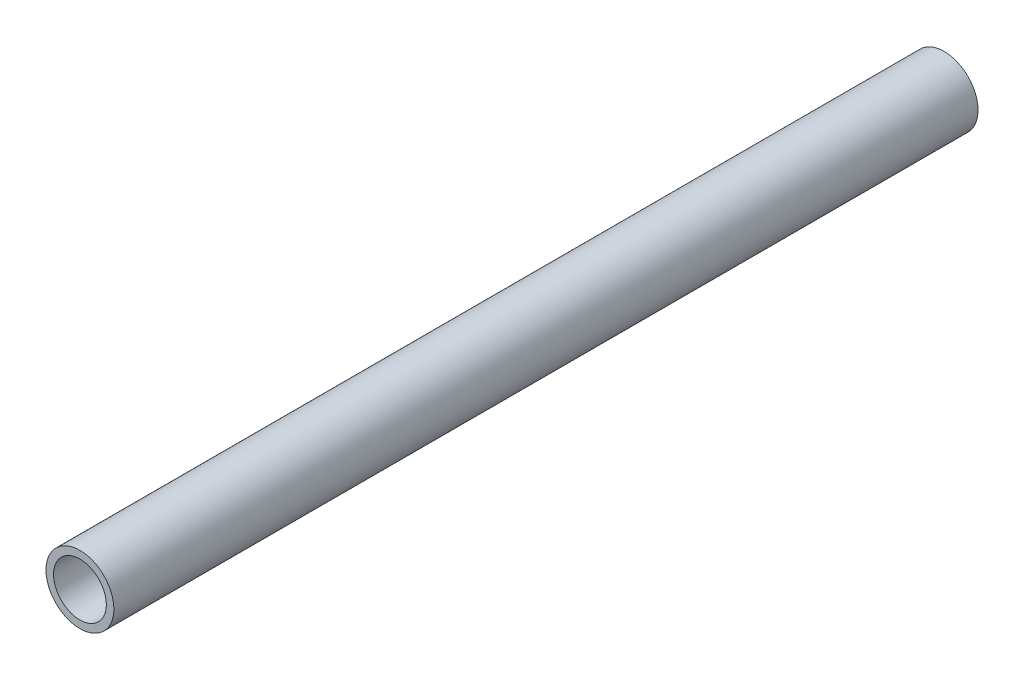
ISO-10303-21;
HEADER;
FILE_DESCRIPTION(('STEP AP214'),'2;1');
FILE_NAME('part.step','',(''),(''),'','','');
FILE_SCHEMA(('AUTOMOTIVE_DESIGN { 1 0 10303 214 1 1 1 1 }'));
ENDSEC;
DATA;
#1=APPLICATION_CONTEXT('core data for automotive mechanical design processes');
#2=APPLICATION_PROTOCOL_DEFINITION('international standard','automotive_design',2000,#1);
#3=PRODUCT_CONTEXT('',#1,'mechanical');
#4=PRODUCT('Part','Part','',(#3));
#5=PRODUCT_RELATED_PRODUCT_CATEGORY('part','',(#4));
#6=PRODUCT_DEFINITION_FORMATION('','',#4);
#7=PRODUCT_DEFINITION_CONTEXT('part definition',#1,'design');
#8=PRODUCT_DEFINITION('design','',#6,#7);
#9=PRODUCT_DEFINITION_SHAPE('','',#8);
#10=(LENGTH_UNIT() NAMED_UNIT(*) SI_UNIT(.MILLI.,.METRE.));
#11=(NAMED_UNIT(*) PLANE_ANGLE_UNIT() SI_UNIT($,.RADIAN.));
#12=(NAMED_UNIT(*) SI_UNIT($,.STERADIAN.) SOLID_ANGLE_UNIT());
#13=UNCERTAINTY_MEASURE_WITH_UNIT(LENGTH_MEASURE(1.E-05),#10,'distance_accuracy_value','');
#14=(GEOMETRIC_REPRESENTATION_CONTEXT(3) GLOBAL_UNCERTAINTY_ASSIGNED_CONTEXT((#13)) GLOBAL_UNIT_ASSIGNED_CONTEXT((#10,
#11,#12)) REPRESENTATION_CONTEXT('',''));
#15=CARTESIAN_POINT('',(0.,0.,0.));
#16=DIRECTION('',(0.,0.,1.));
#17=DIRECTION('',(1.,0.,0.));
#18=AXIS2_PLACEMENT_3D('',#15,#16,#17);
#19=CARTESIAN_POINT('',(0.,0.,229.2769));
#20=DIRECTION('',(0.,0.,1.));
#21=DIRECTION('',(1.,0.,0.));
#22=AXIS2_PLACEMENT_3D('',#19,#20,#21);
#23=PLANE('',#22);
#24=CARTESIAN_POINT('',(0.,0.,229.2769));
#25=DIRECTION('',(0.,0.,1.));
#26=DIRECTION('',(1.,0.,0.));
#27=AXIS2_PLACEMENT_3D('',#24,#25,#26);
#28=CIRCLE('',#27,9.);
#29=CARTESIAN_POINT('',(-9.,0.,229.2769));
#30=VERTEX_POINT('',#29);
#31=EDGE_CURVE('E10',#30,#30,#28,.T.);
#32=ORIENTED_EDGE('',*,*,#31,.T.);
#33=EDGE_LOOP('',(#32));
#34=FACE_BOUND('',#33,.T.);
#35=CARTESIAN_POINT('',(0.,0.,229.2769));
#36=DIRECTION('',(0.,0.,1.));
#37=DIRECTION('',(1.,0.,0.));
#38=AXIS2_PLACEMENT_3D('',#35,#36,#37);
#39=CIRCLE('',#38,7.);
#40=CARTESIAN_POINT('',(-7.,0.,229.2769));
#41=VERTEX_POINT('',#40);
#42=EDGE_CURVE('E44',#41,#41,#39,.T.);
#43=ORIENTED_EDGE('',*,*,#42,.F.);
#44=EDGE_LOOP('',(#43));
#45=FACE_BOUND('',#44,.T.);
#46=ADVANCED_FACE('F33',(#34,#45),#23,.T.);
#47=CARTESIAN_POINT('',(0.,0.,0.));
#48=DIRECTION('',(0.,0.,1.));
#49=DIRECTION('',(1.,0.,0.));
#50=AXIS2_PLACEMENT_3D('',#47,#48,#49);
#51=PLANE('',#50);
#52=CARTESIAN_POINT('',(0.,0.,0.));
#53=DIRECTION('',(0.,0.,1.));
#54=DIRECTION('',(1.,0.,0.));
#55=AXIS2_PLACEMENT_3D('',#52,#53,#54);
#56=CIRCLE('',#55,9.);
#57=CARTESIAN_POINT('',(-9.,0.,0.));
#58=VERTEX_POINT('',#57);
#59=EDGE_CURVE('E37',#58,#58,#56,.T.);
#60=ORIENTED_EDGE('',*,*,#59,.F.);
#61=EDGE_LOOP('',(#60));
#62=FACE_BOUND('',#61,.T.);
#63=CARTESIAN_POINT('',(0.,0.,0.));
#64=DIRECTION('',(0.,0.,1.));
#65=DIRECTION('',(1.,0.,0.));
#66=AXIS2_PLACEMENT_3D('',#63,#64,#65);
#67=CIRCLE('',#66,7.);
#68=CARTESIAN_POINT('',(-7.,0.,0.));
#69=VERTEX_POINT('',#68);
#70=EDGE_CURVE('E46',#69,#69,#67,.T.);
#71=ORIENTED_EDGE('',*,*,#70,.T.);
#72=EDGE_LOOP('',(#71));
#73=FACE_BOUND('',#72,.T.);
#74=ADVANCED_FACE('F56',(#62,#73),#51,.F.);
#75=CARTESIAN_POINT('',(0.,0.,229.2769));
#76=DIRECTION('',(0.,0.,-1.));
#77=DIRECTION('',(-1.,0.,0.));
#78=AXIS2_PLACEMENT_3D('',#75,#76,#77);
#79=CYLINDRICAL_SURFACE('',#78,9.);
#80=CARTESIAN_POINT('',(-9.,0.,229.2769));
#81=CARTESIAN_POINT('',(-9.,0.,226.888598958333));
#82=CARTESIAN_POINT('',(-9.,0.,224.500297916667));
#83=CARTESIAN_POINT('',(-9.,0.,219.723695833333));
#84=CARTESIAN_POINT('',(-9.,0.,217.335394791667));
#85=CARTESIAN_POINT('',(-9.,0.,212.558792708333));
#86=CARTESIAN_POINT('',(-9.,0.,210.170491666667));
#87=CARTESIAN_POINT('',(-9.,0.,205.393889583333));
#88=CARTESIAN_POINT('',(-9.,0.,203.005588541667));
#89=CARTESIAN_POINT('',(-9.,0.,198.228986458333));
#90=CARTESIAN_POINT('',(-9.,0.,195.840685416667));
#91=CARTESIAN_POINT('',(-9.,0.,191.064083333333));
#92=CARTESIAN_POINT('',(-9.,0.,188.675782291667));
#93=CARTESIAN_POINT('',(-9.,0.,183.899180208333));
#94=CARTESIAN_POINT('',(-9.,0.,181.510879166667));
#95=CARTESIAN_POINT('',(-9.,0.,176.734277083333));
#96=CARTESIAN_POINT('',(-9.,0.,174.345976041667));
#97=CARTESIAN_POINT('',(-9.,0.,169.569373958333));
#98=CARTESIAN_POINT('',(-9.,0.,167.181072916667));
#99=CARTESIAN_POINT('',(-9.,0.,162.404470833333));
#100=CARTESIAN_POINT('',(-9.,0.,160.016169791667));
#101=CARTESIAN_POINT('',(-9.,0.,155.239567708333));
#102=CARTESIAN_POINT('',(-9.,0.,152.851266666667));
#103=CARTESIAN_POINT('',(-9.,0.,148.074664583333));
#104=CARTESIAN_POINT('',(-9.,0.,145.686363541667));
#105=CARTESIAN_POINT('',(-9.,0.,140.909761458333));
#106=CARTESIAN_POINT('',(-9.,0.,138.521460416667));
#107=CARTESIAN_POINT('',(-9.,0.,133.744858333333));
#108=CARTESIAN_POINT('',(-9.,0.,131.356557291667));
#109=CARTESIAN_POINT('',(-9.,0.,126.579955208333));
#110=CARTESIAN_POINT('',(-9.,0.,124.191654166667));
#111=CARTESIAN_POINT('',(-9.,0.,119.415052083333));
#112=CARTESIAN_POINT('',(-9.,0.,117.026751041667));
#113=CARTESIAN_POINT('',(-9.,0.,112.250148958333));
#114=CARTESIAN_POINT('',(-9.,0.,109.861847916667));
#115=CARTESIAN_POINT('',(-9.,0.,105.085245833333));
#116=CARTESIAN_POINT('',(-9.,0.,102.696944791667));
#117=CARTESIAN_POINT('',(-9.,0.,97.9203427083334));
#118=CARTESIAN_POINT('',(-9.,0.,95.5320416666667));
#119=CARTESIAN_POINT('',(-9.,0.,90.7554395833333));
#120=CARTESIAN_POINT('',(-9.,0.,88.3671385416666));
#121=CARTESIAN_POINT('',(-9.,0.,83.5905364583333));
#122=CARTESIAN_POINT('',(-9.,0.,81.2022354166667));
#123=CARTESIAN_POINT('',(-9.,0.,76.4256333333333));
#124=CARTESIAN_POINT('',(-9.,0.,74.0373322916667));
#125=CARTESIAN_POINT('',(-9.,0.,69.2607302083333));
#126=CARTESIAN_POINT('',(-9.,0.,66.8724291666666));
#127=CARTESIAN_POINT('',(-9.,0.,62.0958270833333));
#128=CARTESIAN_POINT('',(-9.,0.,59.7075260416667));
#129=CARTESIAN_POINT('',(-9.,0.,54.9309239583333));
#130=CARTESIAN_POINT('',(-9.,0.,52.5426229166667));
#131=CARTESIAN_POINT('',(-9.,0.,47.7660208333333));
#132=CARTESIAN_POINT('',(-9.,0.,45.3777197916666));
#133=CARTESIAN_POINT('',(-9.,0.,40.6011177083333));
#134=CARTESIAN_POINT('',(-9.,0.,38.2128166666666));
#135=CARTESIAN_POINT('',(-9.,0.,33.4362145833333));
#136=CARTESIAN_POINT('',(-9.,0.,31.0479135416666));
#137=CARTESIAN_POINT('',(-9.,0.,26.2713114583333));
#138=CARTESIAN_POINT('',(-9.,0.,23.8830104166666));
#139=CARTESIAN_POINT('',(-9.,0.,19.1064083333333));
#140=CARTESIAN_POINT('',(-9.,0.,16.7181072916666));
#141=CARTESIAN_POINT('',(-9.,0.,11.9415052083333));
#142=CARTESIAN_POINT('',(-9.,0.,9.55320416666664));
#143=CARTESIAN_POINT('',(-9.,0.,4.77660208333331));
#144=CARTESIAN_POINT('',(-9.,0.,2.38830104166664));
#145=CARTESIAN_POINT('',(-9.,0.,0.));
#146=B_SPLINE_CURVE_WITH_KNOTS('',3,(#80,#81,#82,#83,#84,#85,#86,#87,#88,#89,#90,#91,#92,#93,
#94,#95,#96,#97,#98,#99,#100,#101,#102,#103,#104,#105,#106,#107,#108,#109,#110,#111,#112,#113,
#114,#115,#116,#117,#118,#119,#120,#121,#122,#123,#124,#125,#126,#127,#128,#129,#130,#131,#132,
#133,#134,#135,#136,#137,#138,#139,#140,#141,#142,#143,#144,#145),.UNSPECIFIED.,.F.,.F.,(4,2,2,
2,2,2,2,2,2,2,2,2,2,2,2,2,2,2,2,2,2,2,2,2,2,2,2,2,2,2,2,2,4),(0.,7.16490312500001,14.32980625,
21.494709375,28.6596125,35.824515625,42.98941875,50.154321875,57.319225,64.484128125,
71.64903125,78.813934375,85.9788375,93.143740625,100.30864375,107.473546875,114.63845,
121.803353125,128.96825625,136.133159375,143.2980625,150.462965625,157.62786875,164.792771875,
171.957675,179.122578125,186.28748125,193.452384375,200.6172875,207.782190625,214.94709375,
222.111996875,229.2769),.UNSPECIFIED.);
#147=EDGE_CURVE('BSEAM35',#30,#58,#146,.T.);
#148=ORIENTED_EDGE('',*,*,#31,.F.);
#149=ORIENTED_EDGE('',*,*,#59,.T.);
#150=ORIENTED_EDGE('',*,*,#147,.T.);
#151=ORIENTED_EDGE('',*,*,#147,.F.);
#152=EDGE_LOOP('',(#148,#150,#149,#151));
#153=FACE_BOUND('',#152,.T.);
#154=ADVANCED_FACE('F35',(#153),#79,.T.);
#155=CARTESIAN_POINT('',(0.,0.,229.2769));
#156=DIRECTION('',(0.,0.,-1.));
#157=DIRECTION('',(-1.,0.,0.));
#158=AXIS2_PLACEMENT_3D('',#155,#156,#157);
#159=CYLINDRICAL_SURFACE('',#158,7.);
#160=CARTESIAN_POINT('',(-7.,0.,229.2769));
#161=CARTESIAN_POINT('',(-7.,0.,226.888598958333));
#162=CARTESIAN_POINT('',(-7.,0.,224.500297916667));
#163=CARTESIAN_POINT('',(-7.,0.,219.723695833333));
#164=CARTESIAN_POINT('',(-7.,0.,217.335394791667));
#165=CARTESIAN_POINT('',(-7.,0.,212.558792708333));
#166=CARTESIAN_POINT('',(-7.,0.,210.170491666667));
#167=CARTESIAN_POINT('',(-7.,0.,205.393889583333));
#168=CARTESIAN_POINT('',(-7.,0.,203.005588541667));
#169=CARTESIAN_POINT('',(-7.,0.,198.228986458333));
#170=CARTESIAN_POINT('',(-7.,0.,195.840685416667));
#171=CARTESIAN_POINT('',(-7.,0.,191.064083333333));
#172=CARTESIAN_POINT('',(-7.,0.,188.675782291667));
#173=CARTESIAN_POINT('',(-7.,0.,183.899180208333));
#174=CARTESIAN_POINT('',(-7.,0.,181.510879166667));
#175=CARTESIAN_POINT('',(-7.,0.,176.734277083333));
#176=CARTESIAN_POINT('',(-7.,0.,174.345976041667));
#177=CARTESIAN_POINT('',(-7.,0.,169.569373958333));
#178=CARTESIAN_POINT('',(-7.,0.,167.181072916667));
#179=CARTESIAN_POINT('',(-7.,0.,162.404470833333));
#180=CARTESIAN_POINT('',(-7.,0.,160.016169791667));
#181=CARTESIAN_POINT('',(-7.,0.,155.239567708333));
#182=CARTESIAN_POINT('',(-7.,0.,152.851266666667));
#183=CARTESIAN_POINT('',(-7.,0.,148.074664583333));
#184=CARTESIAN_POINT('',(-7.,0.,145.686363541667));
#185=CARTESIAN_POINT('',(-7.,0.,140.909761458333));
#186=CARTESIAN_POINT('',(-7.,0.,138.521460416667));
#187=CARTESIAN_POINT('',(-7.,0.,133.744858333333));
#188=CARTESIAN_POINT('',(-7.,0.,131.356557291667));
#189=CARTESIAN_POINT('',(-7.,0.,126.579955208333));
#190=CARTESIAN_POINT('',(-7.,0.,124.191654166667));
#191=CARTESIAN_POINT('',(-7.,0.,119.415052083333));
#192=CARTESIAN_POINT('',(-7.,0.,117.026751041667));
#193=CARTESIAN_POINT('',(-7.,0.,112.250148958333));
#194=CARTESIAN_POINT('',(-7.,0.,109.861847916667));
#195=CARTESIAN_POINT('',(-7.,0.,105.085245833333));
#196=CARTESIAN_POINT('',(-7.,0.,102.696944791667));
#197=CARTESIAN_POINT('',(-7.,0.,97.9203427083334));
#198=CARTESIAN_POINT('',(-7.,0.,95.5320416666667));
#199=CARTESIAN_POINT('',(-7.,0.,90.7554395833333));
#200=CARTESIAN_POINT('',(-7.,0.,88.3671385416666));
#201=CARTESIAN_POINT('',(-7.,0.,83.5905364583333));
#202=CARTESIAN_POINT('',(-7.,0.,81.2022354166667));
#203=CARTESIAN_POINT('',(-7.,0.,76.4256333333333));
#204=CARTESIAN_POINT('',(-7.,0.,74.0373322916667));
#205=CARTESIAN_POINT('',(-7.,0.,69.2607302083333));
#206=CARTESIAN_POINT('',(-7.,0.,66.8724291666666));
#207=CARTESIAN_POINT('',(-7.,0.,62.0958270833333));
#208=CARTESIAN_POINT('',(-7.,0.,59.7075260416667));
#209=CARTESIAN_POINT('',(-7.,0.,54.9309239583333));
#210=CARTESIAN_POINT('',(-7.,0.,52.5426229166667));
#211=CARTESIAN_POINT('',(-7.,0.,47.7660208333333));
#212=CARTESIAN_POINT('',(-7.,0.,45.3777197916666));
#213=CARTESIAN_POINT('',(-7.,0.,40.6011177083333));
#214=CARTESIAN_POINT('',(-7.,0.,38.2128166666666));
#215=CARTESIAN_POINT('',(-7.,0.,33.4362145833333));
#216=CARTESIAN_POINT('',(-7.,0.,31.0479135416666));
#217=CARTESIAN_POINT('',(-7.,0.,26.2713114583333));
#218=CARTESIAN_POINT('',(-7.,0.,23.8830104166666));
#219=CARTESIAN_POINT('',(-7.,0.,19.1064083333333));
#220=CARTESIAN_POINT('',(-7.,0.,16.7181072916666));
#221=CARTESIAN_POINT('',(-7.,0.,11.9415052083333));
#222=CARTESIAN_POINT('',(-7.,0.,9.55320416666664));
#223=CARTESIAN_POINT('',(-7.,0.,4.77660208333331));
#224=CARTESIAN_POINT('',(-7.,0.,2.38830104166664));
#225=CARTESIAN_POINT('',(-7.,0.,0.));
#226=B_SPLINE_CURVE_WITH_KNOTS('',3,(#160,#161,#162,#163,#164,#165,#166,#167,#168,#169,#170,
#171,#172,#173,#174,#175,#176,#177,#178,#179,#180,#181,#182,#183,#184,#185,#186,#187,#188,#189,
#190,#191,#192,#193,#194,#195,#196,#197,#198,#199,#200,#201,#202,#203,#204,#205,#206,#207,#208,
#209,#210,#211,#212,#213,#214,#215,#216,#217,#218,#219,#220,#221,#222,#223,#224,#225),
.UNSPECIFIED.,.F.,.F.,(4,2,2,2,2,2,2,2,2,2,2,2,2,2,2,2,2,2,2,2,2,2,2,2,2,2,2,2,2,2,2,2,4),(0.,
7.16490312500001,14.32980625,21.494709375,28.6596125,35.824515625,42.98941875,50.154321875,
57.319225,64.484128125,71.64903125,78.813934375,85.9788375,93.143740625,100.30864375,
107.473546875,114.63845,121.803353125,128.96825625,136.133159375,143.2980625,150.462965625,
157.62786875,164.792771875,171.957675,179.122578125,186.28748125,193.452384375,200.6172875,
207.782190625,214.94709375,222.111996875,229.2769),.UNSPECIFIED.);
#227=EDGE_CURVE('BSEAM52',#41,#69,#226,.T.);
#228=ORIENTED_EDGE('',*,*,#42,.T.);
#229=ORIENTED_EDGE('',*,*,#70,.F.);
#230=ORIENTED_EDGE('',*,*,#227,.T.);
#231=ORIENTED_EDGE('',*,*,#227,.F.);
#232=EDGE_LOOP('',(#228,#230,#229,#231));
#233=FACE_BOUND('',#232,.T.);
#234=ADVANCED_FACE('F52',(#233),#159,.F.);
#235=CLOSED_SHELL('',(#46,#74,#154,#234));
#236=MANIFOLD_SOLID_BREP('B2',#235);
#237=ADVANCED_BREP_SHAPE_REPRESENTATION('',(#18,#236),#14);
#238=SHAPE_DEFINITION_REPRESENTATION(#9,#237);
ENDSEC;
END-ISO-10303-21;
